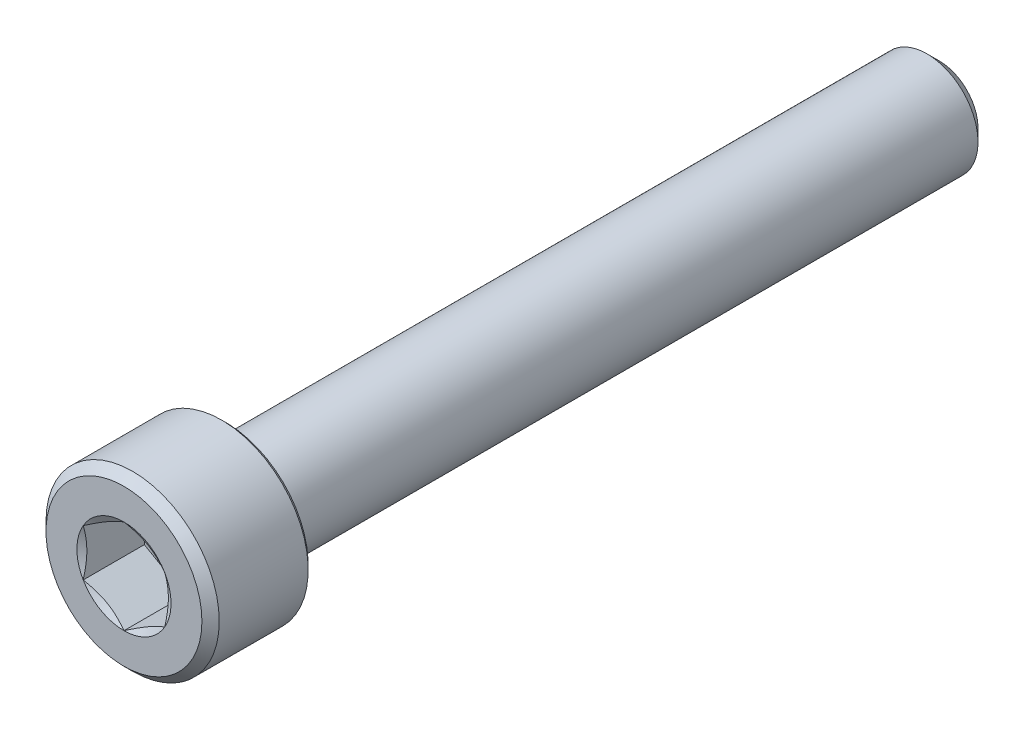
ISO-10303-21;
HEADER;
FILE_DESCRIPTION(('STEP AP214'),'2;1');
FILE_NAME('part.step','',(''),(''),'','','');
FILE_SCHEMA(('AUTOMOTIVE_DESIGN { 1 0 10303 214 1 1 1 1 }'));
ENDSEC;
DATA;
#1=APPLICATION_CONTEXT('core data for automotive mechanical design processes');
#2=APPLICATION_PROTOCOL_DEFINITION('international standard','automotive_design',2000,#1);
#3=PRODUCT_CONTEXT('',#1,'mechanical');
#4=PRODUCT('Part','Part','',(#3));
#5=PRODUCT_RELATED_PRODUCT_CATEGORY('part','',(#4));
#6=PRODUCT_DEFINITION_FORMATION('','',#4);
#7=PRODUCT_DEFINITION_CONTEXT('part definition',#1,'design');
#8=PRODUCT_DEFINITION('design','',#6,#7);
#9=PRODUCT_DEFINITION_SHAPE('','',#8);
#10=(LENGTH_UNIT() NAMED_UNIT(*) SI_UNIT(.MILLI.,.METRE.));
#11=(NAMED_UNIT(*) PLANE_ANGLE_UNIT() SI_UNIT($,.RADIAN.));
#12=(NAMED_UNIT(*) SI_UNIT($,.STERADIAN.) SOLID_ANGLE_UNIT());
#13=UNCERTAINTY_MEASURE_WITH_UNIT(LENGTH_MEASURE(1.E-05),#10,'distance_accuracy_value','');
#14=(GEOMETRIC_REPRESENTATION_CONTEXT(3) GLOBAL_UNCERTAINTY_ASSIGNED_CONTEXT((#13)) GLOBAL_UNIT_ASSIGNED_CONTEXT((#10,
#11,#12)) REPRESENTATION_CONTEXT('',''));
#15=CARTESIAN_POINT('',(0.,0.,0.));
#16=DIRECTION('',(0.,0.,1.));
#17=DIRECTION('',(1.,0.,0.));
#18=AXIS2_PLACEMENT_3D('',#15,#16,#17);
#19=CARTESIAN_POINT('',(0.,4.24999999999999,20.));
#20=DIRECTION('',(0.,0.,1.));
#21=DIRECTION('',(1.,0.,0.));
#22=AXIS2_PLACEMENT_3D('',#19,#20,#21);
#23=PLANE('',#22);
#24=CARTESIAN_POINT('',(0.,0.,20.));
#25=DIRECTION('',(0.,0.,1.));
#26=DIRECTION('',(1.,0.,0.));
#27=AXIS2_PLACEMENT_3D('',#24,#25,#26);
#28=CIRCLE('',#27,3.82499999999999);
#29=CARTESIAN_POINT('',(3.82499999999999,0.,20.));
#30=VERTEX_POINT('',#29);
#31=EDGE_CURVE('E186',#30,#30,#28,.T.);
#32=ORIENTED_EDGE('',*,*,#31,.T.);
#33=EDGE_LOOP('',(#32));
#34=FACE_BOUND('',#33,.T.);
#35=CARTESIAN_POINT('',(0.,0.,20.));
#36=DIRECTION('',(0.,0.,1.));
#37=DIRECTION('',(1.,0.,0.));
#38=AXIS2_PLACEMENT_3D('',#35,#36,#37);
#39=CIRCLE('',#38,2.3094010767585);
#40=CARTESIAN_POINT('',(2.,1.15470053837924,20.));
#41=VERTEX_POINT('',#40);
#42=CARTESIAN_POINT('',(0.,2.3094010767585,20.));
#43=VERTEX_POINT('',#42);
#44=EDGE_CURVE('E96',#41,#43,#39,.T.);
#45=ORIENTED_EDGE('',*,*,#44,.F.);
#46=CARTESIAN_POINT('',(2.,-1.15470053837926,20.));
#47=VERTEX_POINT('',#46);
#48=EDGE_CURVE('E56',#47,#41,#39,.T.);
#49=ORIENTED_EDGE('',*,*,#48,.F.);
#50=CARTESIAN_POINT('',(0.,-2.3094010767585,20.));
#51=VERTEX_POINT('',#50);
#52=EDGE_CURVE('E307',#51,#47,#39,.T.);
#53=ORIENTED_EDGE('',*,*,#52,.F.);
#54=CARTESIAN_POINT('',(-2.,-1.15470053837925,20.));
#55=VERTEX_POINT('',#54);
#56=EDGE_CURVE('E63',#55,#51,#39,.T.);
#57=ORIENTED_EDGE('',*,*,#56,.F.);
#58=CARTESIAN_POINT('',(-2.,1.15470053837925,20.));
#59=VERTEX_POINT('',#58);
#60=EDGE_CURVE('E140',#59,#55,#39,.T.);
#61=ORIENTED_EDGE('',*,*,#60,.F.);
#62=EDGE_CURVE('E106',#43,#59,#39,.T.);
#63=ORIENTED_EDGE('',*,*,#62,.F.);
#64=EDGE_LOOP('',(#45,#49,#53,#57,#61,#63));
#65=FACE_BOUND('',#64,.T.);
#66=ADVANCED_FACE('F41',(#34,#65),#23,.T.);
#67=CARTESIAN_POINT('',(0.,0.,-20.));
#68=DIRECTION('',(0.,0.,-1.));
#69=DIRECTION('',(-1.,0.,0.));
#70=AXIS2_PLACEMENT_3D('',#67,#68,#69);
#71=CYLINDRICAL_SURFACE('',#70,4.25);
#72=CARTESIAN_POINT('',(0.,0.,15.2125));
#73=DIRECTION('',(0.,0.,-1.));
#74=DIRECTION('',(-1.,0.,0.));
#75=AXIS2_PLACEMENT_3D('',#72,#73,#74);
#76=CIRCLE('',#75,4.25);
#77=CARTESIAN_POINT('',(-4.25,0.,15.2125));
#78=VERTEX_POINT('',#77);
#79=EDGE_CURVE('E11',#78,#78,#76,.F.);
#80=ORIENTED_EDGE('',*,*,#79,.T.);
#81=EDGE_LOOP('',(#80));
#82=FACE_BOUND('',#81,.T.);
#83=CARTESIAN_POINT('',(0.,0.,19.575));
#84=DIRECTION('',(0.,0.,1.));
#85=DIRECTION('',(1.,0.,0.));
#86=AXIS2_PLACEMENT_3D('',#83,#84,#85);
#87=CIRCLE('',#86,4.25);
#88=CARTESIAN_POINT('',(4.25,0.,19.575));
#89=VERTEX_POINT('',#88);
#90=EDGE_CURVE('E117',#89,#89,#87,.F.);
#91=ORIENTED_EDGE('',*,*,#90,.T.);
#92=EDGE_LOOP('',(#91));
#93=FACE_BOUND('',#92,.T.);
#94=ADVANCED_FACE('F205',(#82,#93),#71,.T.);
#95=CARTESIAN_POINT('',(0.,4.24999999999999,15.));
#96=DIRECTION('',(0.,0.,-1.));
#97=DIRECTION('',(-1.,0.,0.));
#98=AXIS2_PLACEMENT_3D('',#95,#96,#97);
#99=PLANE('',#98);
#100=CARTESIAN_POINT('',(0.,0.,15.));
#101=DIRECTION('',(0.,0.,-1.));
#102=DIRECTION('',(-1.,0.,0.));
#103=AXIS2_PLACEMENT_3D('',#100,#101,#102);
#104=CIRCLE('',#103,4.03750000000001);
#105=CARTESIAN_POINT('',(-4.03750000000001,0.,15.));
#106=VERTEX_POINT('',#105);
#107=EDGE_CURVE('E50',#106,#106,#104,.T.);
#108=ORIENTED_EDGE('',*,*,#107,.T.);
#109=EDGE_LOOP('',(#108));
#110=FACE_BOUND('',#109,.T.);
#111=CARTESIAN_POINT('',(0.,0.,15.));
#112=DIRECTION('',(0.,0.,-1.));
#113=DIRECTION('',(-1.,0.,0.));
#114=AXIS2_PLACEMENT_3D('',#111,#112,#113);
#115=CIRCLE('',#114,2.5);
#116=CARTESIAN_POINT('',(-2.5,0.,15.));
#117=VERTEX_POINT('',#116);
#118=EDGE_CURVE('E118',#117,#117,#115,.T.);
#119=ORIENTED_EDGE('',*,*,#118,.F.);
#120=EDGE_LOOP('',(#119));
#121=FACE_BOUND('',#120,.T.);
#122=ADVANCED_FACE('F193',(#110,#121),#99,.T.);
#123=CARTESIAN_POINT('',(0.,0.,-20.));
#124=DIRECTION('',(0.,0.,-1.));
#125=DIRECTION('',(-1.,0.,0.));
#126=AXIS2_PLACEMENT_3D('',#123,#124,#125);
#127=CYLINDRICAL_SURFACE('',#126,2.5);
#128=ORIENTED_EDGE('',*,*,#118,.T.);
#129=EDGE_LOOP('',(#128));
#130=FACE_BOUND('',#129,.T.);
#131=CARTESIAN_POINT('',(0.,0.,-19.4));
#132=DIRECTION('',(0.,0.,-1.));
#133=DIRECTION('',(-1.,0.,0.));
#134=AXIS2_PLACEMENT_3D('',#131,#132,#133);
#135=CIRCLE('',#134,2.5);
#136=CARTESIAN_POINT('',(-2.5,0.,-19.4));
#137=VERTEX_POINT('',#136);
#138=EDGE_CURVE('E235',#137,#137,#135,.T.);
#139=ORIENTED_EDGE('',*,*,#138,.F.);
#140=EDGE_LOOP('',(#139));
#141=FACE_BOUND('',#140,.T.);
#142=ADVANCED_FACE('F216',(#130,#141),#127,.T.);
#143=CARTESIAN_POINT('',(0.,0.,-20.));
#144=DIRECTION('',(0.,0.,1.));
#145=DIRECTION('',(1.,0.,0.));
#146=AXIS2_PLACEMENT_3D('',#143,#144,#145);
#147=CONICAL_SURFACE('',#146,1.89999999999999,0.785398163397441);
#148=ORIENTED_EDGE('',*,*,#138,.T.);
#149=EDGE_LOOP('',(#148));
#150=FACE_BOUND('',#149,.T.);
#151=CARTESIAN_POINT('',(0.,0.,-20.));
#152=DIRECTION('',(0.,0.,-1.));
#153=DIRECTION('',(-1.,0.,0.));
#154=AXIS2_PLACEMENT_3D('',#151,#152,#153);
#155=CIRCLE('',#154,1.89999999999999);
#156=CARTESIAN_POINT('',(-1.89999999999999,0.,-20.));
#157=VERTEX_POINT('',#156);
#158=EDGE_CURVE('E232',#157,#157,#155,.T.);
#159=ORIENTED_EDGE('',*,*,#158,.F.);
#160=EDGE_LOOP('',(#159));
#161=FACE_BOUND('',#160,.T.);
#162=ADVANCED_FACE('F219',(#150,#161),#147,.T.);
#163=CARTESIAN_POINT('',(0.,1.89999999999999,-20.));
#164=DIRECTION('',(0.,0.,-1.));
#165=DIRECTION('',(-1.,0.,0.));
#166=AXIS2_PLACEMENT_3D('',#163,#164,#165);
#167=PLANE('',#166);
#168=ORIENTED_EDGE('',*,*,#158,.T.);
#169=EDGE_LOOP('',(#168));
#170=FACE_BOUND('',#169,.T.);
#171=ADVANCED_FACE('F222',(#170),#167,.T.);
#172=CARTESIAN_POINT('',(0.,0.,20.));
#173=DIRECTION('',(0.,0.,1.));
#174=DIRECTION('',(1.,0.,0.));
#175=AXIS2_PLACEMENT_3D('',#172,#173,#174);
#176=CONICAL_SURFACE('',#175,2.3094010767585,1.0471975511966);
#177=ORIENTED_EDGE('',*,*,#62,.T.);
#178=CARTESIAN_POINT('',(0.00019999999999952,2.30951654681234,20.0000666716664));
#179=CARTESIAN_POINT('',(-0.0876912629000603,2.25877250251757,19.9707567411466));
#180=CARTESIAN_POINT('',(-0.176341194473592,2.20759044065995,19.9441000570264));
#181=CARTESIAN_POINT('',(-0.355176246997802,2.10433997494456,19.8975696960666));
#182=CARTESIAN_POINT('',(-0.445364546505036,2.0522697359463,19.8777124814287));
#183=CARTESIAN_POINT('',(-0.624623385763305,1.94877459684592,19.8468006690692));
#184=CARTESIAN_POINT('',(-0.713666338226303,1.89736562427197,19.8355403566444));
#185=CARTESIAN_POINT('',(-0.892171397785042,1.79430568008402,19.8220958676406));
#186=CARTESIAN_POINT('',(-0.981632855703957,1.74265508327244,19.8199005599994));
#187=CARTESIAN_POINT('',(-1.1488083535488,1.64613626458981,19.8244581943766));
#188=CARTESIAN_POINT('',(-1.22654737026578,1.60125362236172,19.8300920797329));
#189=CARTESIAN_POINT('',(-1.38151891453613,1.5117807595605,19.8479511003067));
#190=CARTESIAN_POINT('',(-1.4587509057412,1.46719084864821,19.8601823410694));
#191=CARTESIAN_POINT('',(-1.6140421864822,1.37753338590959,19.8907606419135));
#192=CARTESIAN_POINT('',(-1.69208181310738,1.33247718647008,19.9092373721116));
#193=CARTESIAN_POINT('',(-1.84699686569213,1.24303693915875,19.9511727232588));
#194=CARTESIAN_POINT('',(-1.92387427762312,1.19865174468579,19.9746214855382));
#195=CARTESIAN_POINT('',(-2.0002,1.15458506832541,20.0000666716664));
#196=B_SPLINE_CURVE_WITH_KNOTS('',3,(#178,#179,#180,#181,#182,#183,#184,#185,#186,#187,#188,
#189,#190,#191,#192,#193,#194,#195),.UNSPECIFIED.,.F.,.F.,(4,2,2,2,2,2,2,2,4),(0.,
0.31703182469561,0.634825876346563,0.944753967652634,1.25430138000371,1.52387047293094,
1.79368946861028,2.06949491027634,2.34475850821472),.UNSPECIFIED.);
#197=EDGE_CURVE('E111',#43,#59,#196,.T.);
#198=ORIENTED_EDGE('',*,*,#197,.F.);
#199=EDGE_LOOP('',(#177,#198));
#200=FACE_BOUND('',#199,.T.);
#201=ADVANCED_FACE('F112',(#200),#176,.F.);
#202=ORIENTED_EDGE('',*,*,#60,.T.);
#203=CARTESIAN_POINT('',(-2.,-2.99029024286748,20.7436705774789));
#204=CARTESIAN_POINT('',(-2.,-2.90392335491221,20.7022350128154));
#205=CARTESIAN_POINT('',(-2.,-2.81734606544377,20.6612298310159));
#206=CARTESIAN_POINT('',(-2.,-2.64365854493736,20.5803243821909));
#207=CARTESIAN_POINT('',(-2.,-2.55654822138745,20.5404243140125));
#208=CARTESIAN_POINT('',(-2.,-2.38118302896118,20.4617503389694));
#209=CARTESIAN_POINT('',(-2.,-2.29292442261224,20.4229847316336));
#210=CARTESIAN_POINT('',(-2.,-2.11566660170983,20.3471918635543));
#211=CARTESIAN_POINT('',(-2.,-2.02666742594868,20.3101645124244));
#212=CARTESIAN_POINT('',(-2.,-1.84544249851512,20.2373681681925));
#213=CARTESIAN_POINT('',(-2.,-1.75319322532995,20.201657387434));
#214=CARTESIAN_POINT('',(-2.,-1.56757885700114,20.1332048464352));
#215=CARTESIAN_POINT('',(-2.,-1.4742136338563,20.1004634305571));
#216=CARTESIAN_POINT('',(-2.,-1.28643446361951,20.0388859327172));
#217=CARTESIAN_POINT('',(-2.,-1.19202351048257,20.0100408191443));
#218=CARTESIAN_POINT('',(-2.,-1.00184859453873,19.9572423245237));
#219=CARTESIAN_POINT('',(-2.,-0.906084974095547,19.9332877285792));
#220=CARTESIAN_POINT('',(-2.,-0.713403981060257,19.8915474538638));
#221=CARTESIAN_POINT('',(-2.,-0.616489407871839,19.8737491049484));
#222=CARTESIAN_POINT('',(-2.,-0.421576659767194,19.8454859555612));
#223=CARTESIAN_POINT('',(-2.,-0.323578558532566,19.8350206595082));
#224=CARTESIAN_POINT('',(-2.,-0.128212412243738,19.8223976828881));
#225=CARTESIAN_POINT('',(-2.,-0.0308508865278569,19.8201419664817));
#226=CARTESIAN_POINT('',(-2.,0.163710907351541,19.8238660001585));
#227=CARTESIAN_POINT('',(-2.,0.260911165156857,19.8298462601828));
#228=CARTESIAN_POINT('',(-2.,0.500738496705997,19.8542367986828));
#229=CARTESIAN_POINT('',(-2.,0.642900874941924,19.8772179857328));
#230=CARTESIAN_POINT('',(-2.,0.924461055762403,19.9364797724985));
#231=CARTESIAN_POINT('',(-2.,1.06385531203148,19.9727764011974));
#232=CARTESIAN_POINT('',(-2.,1.27233476439731,20.0347799260889));
#233=CARTESIAN_POINT('',(-2.,1.34249760828297,20.0569967132613));
#234=CARTESIAN_POINT('',(-2.,1.48209294499886,20.1034854664852));
#235=CARTESIAN_POINT('',(-2.,1.5515258636265,20.1277561499463));
#236=CARTESIAN_POINT('',(-2.,1.68975413890004,20.1780002153862));
#237=CARTESIAN_POINT('',(-2.,1.75854960883307,20.2039732879257));
#238=CARTESIAN_POINT('',(-2.,1.89559846372949,20.2573411907401));
#239=CARTESIAN_POINT('',(-2.,1.96385175484501,20.2847362612267));
#240=CARTESIAN_POINT('',(-2.,2.1380709928287,20.3564181386155));
#241=CARTESIAN_POINT('',(-2.,2.24368858156614,20.4015507076219));
#242=CARTESIAN_POINT('',(-2.,2.45396999511265,20.4939914959885));
#243=CARTESIAN_POINT('',(-2.,2.55863374776563,20.5412998783351));
#244=CARTESIAN_POINT('',(-2.,2.87151206778261,20.6857217451608));
#245=CARTESIAN_POINT('',(-2.,3.07857874872549,20.7853171433883));
#246=CARTESIAN_POINT('',(-2.,3.49094307145926,20.9886849551519));
#247=CARTESIAN_POINT('',(-2.,3.69623822556833,21.0924623531372));
#248=CARTESIAN_POINT('',(-2.,4.10542196763742,21.3026856010433));
#249=CARTESIAN_POINT('',(-2.,4.30931073022523,21.4091311117793));
#250=CARTESIAN_POINT('',(-2.,4.69691639401988,21.613726514207));
#251=CARTESIAN_POINT('',(-2.,4.88072085209384,21.7117111050986));
#252=CARTESIAN_POINT('',(-2.,5.2477385233816,21.9087967213488));
#253=CARTESIAN_POINT('',(-2.,5.43095171439013,22.0078977880236));
#254=CARTESIAN_POINT('',(-2.,5.79645714315414,22.2066832443465));
#255=CARTESIAN_POINT('',(-2.,5.97875053807595,22.3063655091631));
#256=CARTESIAN_POINT('',(-2.,6.34296877430456,22.5063788260171));
#257=CARTESIAN_POINT('',(-2.,6.52489363439936,22.6067098438291));
#258=CARTESIAN_POINT('',(-2.,6.70668608827319,22.7072787608358));
#259=B_SPLINE_CURVE_WITH_KNOTS('',3,(#203,#204,#205,#206,#207,#208,#209,#210,#211,#212,#213,
#214,#215,#216,#217,#218,#219,#220,#221,#222,#223,#224,#225,#226,#227,#228,#229,#230,#231,#232,
#233,#234,#235,#236,#237,#238,#239,#240,#241,#242,#243,#244,#245,#246,#247,#248,#249,#250,#251,
#252,#253,#254,#255,#256,#257,#258),.UNSPECIFIED.,.F.,.F.,(4,2,2,2,2,2,2,2,2,2,2,2,2,2,2,2,2,2,
2,2,2,2,2,2,2,2,2,4),(0.,0.287380681388115,0.574812740623685,0.863988372930492,1.15314895189073,
1.44986982597591,1.74662506739397,2.04268017375205,2.33866164470186,2.63403028141923,
2.92937895465127,3.2211888892799,3.51301689251079,3.94415417741652,4.37581217290737,
4.59657665342086,4.81720427698906,5.03779190819846,5.2584169243092,5.60295100374335,
5.94751093378604,6.63674459882492,7.32682556520814,8.01681924533216,8.64168728907531,
9.26657853306546,9.889880351341,10.5131495508289),.UNSPECIFIED.);
#260=EDGE_CURVE('E105',#59,#55,#259,.F.);
#261=ORIENTED_EDGE('',*,*,#260,.F.);
#262=EDGE_LOOP('',(#202,#261));
#263=FACE_BOUND('',#262,.T.);
#264=ADVANCED_FACE('F229',(#263),#176,.F.);
#265=ORIENTED_EDGE('',*,*,#56,.T.);
#266=CARTESIAN_POINT('',(-2.0002,-1.15458506832542,20.0000666716664));
#267=CARTESIAN_POINT('',(-1.91230873709994,-1.20532911262019,19.9707567411466));
#268=CARTESIAN_POINT('',(-1.82365880552641,-1.25651117447781,19.9441000570264));
#269=CARTESIAN_POINT('',(-1.6448237530022,-1.3597616401932,19.8975696960666));
#270=CARTESIAN_POINT('',(-1.55463545349496,-1.41183187919146,19.8777124814287));
#271=CARTESIAN_POINT('',(-1.37537661423669,-1.51532701829184,19.8468006690692));
#272=CARTESIAN_POINT('',(-1.2863336617737,-1.56673599086579,19.8355403566444));
#273=CARTESIAN_POINT('',(-1.10782860221496,-1.66979593505374,19.8220958676406));
#274=CARTESIAN_POINT('',(-1.01836714429604,-1.72144653186532,19.8199005599994));
#275=CARTESIAN_POINT('',(-0.851191646451203,-1.81796535054795,19.8244581943766));
#276=CARTESIAN_POINT('',(-0.773452629734217,-1.86284799277603,19.8300920797329));
#277=CARTESIAN_POINT('',(-0.618481085463867,-1.95232085557725,19.8479511003067));
#278=CARTESIAN_POINT('',(-0.541249094258802,-1.99691076648955,19.8601823410694));
#279=CARTESIAN_POINT('',(-0.385957813517799,-2.08656822922817,19.8907606419135));
#280=CARTESIAN_POINT('',(-0.307918186892621,-2.13162442866767,19.9092373721116));
#281=CARTESIAN_POINT('',(-0.153003134307865,-2.22106467597901,19.9511727232588));
#282=CARTESIAN_POINT('',(-0.0761257223768795,-2.26544987045196,19.9746214855382));
#283=CARTESIAN_POINT('',(0.000200000000000404,-2.30951654681235,20.0000666716664));
#284=B_SPLINE_CURVE_WITH_KNOTS('',3,(#266,#267,#268,#269,#270,#271,#272,#273,#274,#275,#276,
#277,#278,#279,#280,#281,#282,#283),.UNSPECIFIED.,.F.,.F.,(4,2,2,2,2,2,2,2,4),(0.,
0.317031824695609,0.634825876346562,0.944753967652634,1.25430138000371,1.52387047293094,
1.79368946861028,2.06949491027634,2.34475850821472),.UNSPECIFIED.);
#285=EDGE_CURVE('E153',#55,#51,#284,.T.);
#286=ORIENTED_EDGE('',*,*,#285,.F.);
#287=EDGE_LOOP('',(#265,#286));
#288=FACE_BOUND('',#287,.T.);
#289=ADVANCED_FACE('F315',(#288),#176,.F.);
#290=ORIENTED_EDGE('',*,*,#52,.T.);
#291=CARTESIAN_POINT('',(-0.000200000000000021,-2.30951654681235,20.0000666716664));
#292=CARTESIAN_POINT('',(0.0876912629000599,-2.25877250251758,19.9707567411466));
#293=CARTESIAN_POINT('',(0.176341194473591,-2.20759044065996,19.9441000570264));
#294=CARTESIAN_POINT('',(0.355176246997801,-2.10433997494457,19.8975696960666));
#295=CARTESIAN_POINT('',(0.445364546505036,-2.05226973594631,19.8777124814287));
#296=CARTESIAN_POINT('',(0.624623385763306,-1.94877459684593,19.8468006690692));
#297=CARTESIAN_POINT('',(0.713666338226304,-1.89736562427198,19.8355403566444));
#298=CARTESIAN_POINT('',(0.892171397785043,-1.79430568008403,19.8220958676406));
#299=CARTESIAN_POINT('',(0.981632855703958,-1.74265508327245,19.8199005599994));
#300=CARTESIAN_POINT('',(1.1488083535488,-1.64613626458982,19.8244581943766));
#301=CARTESIAN_POINT('',(1.22654737026578,-1.60125362236173,19.8300920797329));
#302=CARTESIAN_POINT('',(1.38151891453613,-1.51178075956051,19.8479511003067));
#303=CARTESIAN_POINT('',(1.4587509057412,-1.46719084864822,19.8601823410694));
#304=CARTESIAN_POINT('',(1.6140421864822,-1.3775333859096,19.8907606419135));
#305=CARTESIAN_POINT('',(1.69208181310738,-1.33247718647009,19.9092373721116));
#306=CARTESIAN_POINT('',(1.84699686569213,-1.24303693915876,19.9511727232588));
#307=CARTESIAN_POINT('',(1.92387427762312,-1.1986517446858,19.9746214855382));
#308=CARTESIAN_POINT('',(2.0002,-1.15458506832542,20.0000666716664));
#309=B_SPLINE_CURVE_WITH_KNOTS('',3,(#291,#292,#293,#294,#295,#296,#297,#298,#299,#300,#301,
#302,#303,#304,#305,#306,#307,#308),.UNSPECIFIED.,.F.,.F.,(4,2,2,2,2,2,2,2,4),(0.,
0.317031824695609,0.634825876346563,0.944753967652636,1.25430138000371,1.52387047293094,
1.79368946861028,2.06949491027634,2.34475850821472),.UNSPECIFIED.);
#310=EDGE_CURVE('E284',#51,#47,#309,.T.);
#311=ORIENTED_EDGE('',*,*,#310,.F.);
#312=EDGE_LOOP('',(#290,#311));
#313=FACE_BOUND('',#312,.T.);
#314=ADVANCED_FACE('F312',(#313),#176,.F.);
#315=ORIENTED_EDGE('',*,*,#48,.T.);
#316=CARTESIAN_POINT('',(2.,-2.99029024286747,20.7436705774789));
#317=CARTESIAN_POINT('',(2.,-2.90392335491221,20.7022350128154));
#318=CARTESIAN_POINT('',(2.,-2.81734606544377,20.6612298310159));
#319=CARTESIAN_POINT('',(2.,-2.64365854493736,20.5803243821909));
#320=CARTESIAN_POINT('',(2.,-2.55654822138745,20.5404243140125));
#321=CARTESIAN_POINT('',(2.,-2.38118302896118,20.4617503389694));
#322=CARTESIAN_POINT('',(2.,-2.29292442261224,20.4229847316336));
#323=CARTESIAN_POINT('',(2.,-2.11566660170983,20.3471918635543));
#324=CARTESIAN_POINT('',(2.,-2.02666742594868,20.3101645124244));
#325=CARTESIAN_POINT('',(2.,-1.84544249851512,20.2373681681925));
#326=CARTESIAN_POINT('',(2.,-1.75319322532995,20.201657387434));
#327=CARTESIAN_POINT('',(2.,-1.56757885700113,20.1332048464352));
#328=CARTESIAN_POINT('',(2.,-1.4742136338563,20.1004634305571));
#329=CARTESIAN_POINT('',(2.,-1.28643446361951,20.0388859327172));
#330=CARTESIAN_POINT('',(2.,-1.19202351048257,20.0100408191443));
#331=CARTESIAN_POINT('',(2.,-1.00184859453872,19.9572423245237));
#332=CARTESIAN_POINT('',(2.,-0.906084974095546,19.9332877285792));
#333=CARTESIAN_POINT('',(2.,-0.713403981060256,19.8915474538638));
#334=CARTESIAN_POINT('',(2.,-0.616489407871839,19.8737491049484));
#335=CARTESIAN_POINT('',(2.,-0.421576659767193,19.8454859555612));
#336=CARTESIAN_POINT('',(2.,-0.323578558532565,19.8350206595082));
#337=CARTESIAN_POINT('',(2.,-0.128212412243737,19.8223976828881));
#338=CARTESIAN_POINT('',(2.,-0.0308508865278556,19.8201419664817));
#339=CARTESIAN_POINT('',(2.,0.163710907351542,19.8238660001585));
#340=CARTESIAN_POINT('',(2.,0.260911165156859,19.8298462601828));
#341=CARTESIAN_POINT('',(2.,0.500738496705998,19.8542367986828));
#342=CARTESIAN_POINT('',(2.,0.642900874941926,19.8772179857328));
#343=CARTESIAN_POINT('',(2.,0.924461055762404,19.9364797724985));
#344=CARTESIAN_POINT('',(2.,1.06385531203148,19.9727764011974));
#345=CARTESIAN_POINT('',(2.,1.27233476439731,20.0347799260889));
#346=CARTESIAN_POINT('',(2.,1.34249760828297,20.0569967132613));
#347=CARTESIAN_POINT('',(2.,1.48209294499886,20.1034854664852));
#348=CARTESIAN_POINT('',(2.,1.5515258636265,20.1277561499463));
#349=CARTESIAN_POINT('',(2.,1.68975413890005,20.1780002153862));
#350=CARTESIAN_POINT('',(2.,1.75854960883307,20.2039732879257));
#351=CARTESIAN_POINT('',(2.,1.89559846372949,20.2573411907401));
#352=CARTESIAN_POINT('',(2.,1.96385175484502,20.2847362612267));
#353=CARTESIAN_POINT('',(2.,2.1380709928287,20.3564181386155));
#354=CARTESIAN_POINT('',(2.,2.24368858156614,20.4015507076219));
#355=CARTESIAN_POINT('',(2.,2.45396999511265,20.4939914959885));
#356=CARTESIAN_POINT('',(2.,2.55863374776564,20.5412998783351));
#357=CARTESIAN_POINT('',(2.,2.87151206778262,20.6857217451608));
#358=CARTESIAN_POINT('',(2.,3.0785787487255,20.7853171433883));
#359=CARTESIAN_POINT('',(2.,3.49094307145926,20.9886849551519));
#360=CARTESIAN_POINT('',(2.,3.69623822556834,21.0924623531372));
#361=CARTESIAN_POINT('',(2.,4.10542196763743,21.3026856010433));
#362=CARTESIAN_POINT('',(2.,4.30931073022523,21.4091311117793));
#363=CARTESIAN_POINT('',(2.,4.69691639401988,21.613726514207));
#364=CARTESIAN_POINT('',(2.,4.88072085209384,21.7117111050986));
#365=CARTESIAN_POINT('',(2.,5.2477385233816,21.9087967213488));
#366=CARTESIAN_POINT('',(2.,5.43095171439014,22.0078977880236));
#367=CARTESIAN_POINT('',(2.,5.79645714315414,22.2066832443465));
#368=CARTESIAN_POINT('',(2.,5.97875053807595,22.3063655091631));
#369=CARTESIAN_POINT('',(2.,6.34296877430456,22.5063788260171));
#370=CARTESIAN_POINT('',(2.,6.52489363439936,22.6067098438291));
#371=CARTESIAN_POINT('',(2.,6.70668608827319,22.7072787608358));
#372=B_SPLINE_CURVE_WITH_KNOTS('',3,(#316,#317,#318,#319,#320,#321,#322,#323,#324,#325,#326,
#327,#328,#329,#330,#331,#332,#333,#334,#335,#336,#337,#338,#339,#340,#341,#342,#343,#344,#345,
#346,#347,#348,#349,#350,#351,#352,#353,#354,#355,#356,#357,#358,#359,#360,#361,#362,#363,#364,
#365,#366,#367,#368,#369,#370,#371),.UNSPECIFIED.,.F.,.F.,(4,2,2,2,2,2,2,2,2,2,2,2,2,2,2,2,2,2,
2,2,2,2,2,2,2,2,2,4),(0.,0.287380681388115,0.574812740623685,0.863988372930493,1.15314895189073,
1.44986982597591,1.74662506739397,2.04268017375206,2.33866164470186,2.63403028141923,
2.92937895465127,3.2211888892799,3.51301689251079,3.94415417741652,4.37581217290737,
4.59657665342086,4.81720427698906,5.03779190819846,5.2584169243092,5.60295100374335,
5.94751093378604,6.63674459882492,7.32682556520814,8.01681924533217,8.64168728907531,
9.26657853306546,9.889880351341,10.5131495508289),.UNSPECIFIED.);
#373=EDGE_CURVE('E129',#47,#41,#372,.T.);
#374=ORIENTED_EDGE('',*,*,#373,.F.);
#375=EDGE_LOOP('',(#315,#374));
#376=FACE_BOUND('',#375,.T.);
#377=ADVANCED_FACE('F325',(#376),#176,.F.);
#378=ORIENTED_EDGE('',*,*,#44,.T.);
#379=CARTESIAN_POINT('',(2.0002,1.15458506832541,20.0000666716664));
#380=CARTESIAN_POINT('',(1.91230873709994,1.20532911262017,19.9707567411466));
#381=CARTESIAN_POINT('',(1.82365880552641,1.25651117447779,19.9441000570264));
#382=CARTESIAN_POINT('',(1.6448237530022,1.35976164019319,19.8975696960666));
#383=CARTESIAN_POINT('',(1.55463545349496,1.41183187919144,19.8777124814287));
#384=CARTESIAN_POINT('',(1.37537661423669,1.51532701829183,19.8468006690692));
#385=CARTESIAN_POINT('',(1.2863336617737,1.56673599086578,19.8355403566444));
#386=CARTESIAN_POINT('',(1.10782860221496,1.66979593505372,19.8220958676406));
#387=CARTESIAN_POINT('',(1.01836714429604,1.72144653186531,19.8199005599994));
#388=CARTESIAN_POINT('',(0.851191646451203,1.81796535054793,19.8244581943766));
#389=CARTESIAN_POINT('',(0.773452629734218,1.86284799277602,19.8300920797329));
#390=CARTESIAN_POINT('',(0.618481085463868,1.95232085557724,19.8479511003067));
#391=CARTESIAN_POINT('',(0.541249094258803,1.99691076648954,19.8601823410694));
#392=CARTESIAN_POINT('',(0.3859578135178,2.08656822922816,19.8907606419135));
#393=CARTESIAN_POINT('',(0.307918186892621,2.13162442866766,19.9092373721116));
#394=CARTESIAN_POINT('',(0.153003134307865,2.22106467597899,19.9511727232588));
#395=CARTESIAN_POINT('',(0.0761257223768795,2.26544987045195,19.9746214855382));
#396=CARTESIAN_POINT('',(-0.000200000000000734,2.30951654681234,20.0000666716664));
#397=B_SPLINE_CURVE_WITH_KNOTS('',3,(#379,#380,#381,#382,#383,#384,#385,#386,#387,#388,#389,
#390,#391,#392,#393,#394,#395,#396),.UNSPECIFIED.,.F.,.F.,(4,2,2,2,2,2,2,2,4),(0.,
0.317031824695609,0.634825876346562,0.944753967652634,1.25430138000371,1.52387047293094,
1.79368946861028,2.06949491027634,2.34475850821472),.UNSPECIFIED.);
#398=EDGE_CURVE('E100',#41,#43,#397,.T.);
#399=ORIENTED_EDGE('',*,*,#398,.F.);
#400=EDGE_LOOP('',(#378,#399));
#401=FACE_BOUND('',#400,.T.);
#402=ADVANCED_FACE('F98',(#401),#176,.F.);
#403=CARTESIAN_POINT('',(0.,0.,17.));
#404=DIRECTION('',(0.,0.,1.));
#405=DIRECTION('',(1.,0.,0.));
#406=AXIS2_PLACEMENT_3D('',#403,#404,#405);
#407=PLANE('',#406);
#408=DIRECTION('',(-0.866025403784439,0.5,0.));
#409=VECTOR('',#408,1.);
#410=CARTESIAN_POINT('',(2.,1.15470053837925,17.));
#411=LINE('',#410,#409);
#412=CARTESIAN_POINT('',(2.,1.15470053837925,17.));
#413=VERTEX_POINT('',#412);
#414=CARTESIAN_POINT('',(0.,2.3094010767585,17.));
#415=VERTEX_POINT('',#414);
#416=EDGE_CURVE('E128',#413,#415,#411,.T.);
#417=ORIENTED_EDGE('',*,*,#416,.T.);
#418=DIRECTION('',(-0.866025403784439,-0.5,0.));
#419=VECTOR('',#418,1.);
#420=CARTESIAN_POINT('',(0.,2.3094010767585,17.));
#421=LINE('',#420,#419);
#422=CARTESIAN_POINT('',(-2.,1.15470053837925,17.));
#423=VERTEX_POINT('',#422);
#424=EDGE_CURVE('E133',#415,#423,#421,.T.);
#425=ORIENTED_EDGE('',*,*,#424,.T.);
#426=DIRECTION('',(0.,-1.,0.));
#427=VECTOR('',#426,1.);
#428=CARTESIAN_POINT('',(-2.,1.15470053837925,17.));
#429=LINE('',#428,#427);
#430=CARTESIAN_POINT('',(-2.,-1.15470053837926,17.));
#431=VERTEX_POINT('',#430);
#432=EDGE_CURVE('E266',#423,#431,#429,.T.);
#433=ORIENTED_EDGE('',*,*,#432,.T.);
#434=DIRECTION('',(0.866025403784439,-0.5,0.));
#435=VECTOR('',#434,1.);
#436=CARTESIAN_POINT('',(-2.,-1.15470053837926,17.));
#437=LINE('',#436,#435);
#438=CARTESIAN_POINT('',(0.,-2.30940107675851,17.));
#439=VERTEX_POINT('',#438);
#440=EDGE_CURVE('E262',#431,#439,#437,.T.);
#441=ORIENTED_EDGE('',*,*,#440,.T.);
#442=DIRECTION('',(0.866025403784438,0.5,0.));
#443=VECTOR('',#442,1.);
#444=CARTESIAN_POINT('',(0.,-2.30940107675851,17.));
#445=LINE('',#444,#443);
#446=CARTESIAN_POINT('',(2.,-1.15470053837926,17.));
#447=VERTEX_POINT('',#446);
#448=EDGE_CURVE('E258',#439,#447,#445,.T.);
#449=ORIENTED_EDGE('',*,*,#448,.T.);
#450=DIRECTION('',(0.,1.,0.));
#451=VECTOR('',#450,1.);
#452=CARTESIAN_POINT('',(2.,-1.15470053837926,17.));
#453=LINE('',#452,#451);
#454=EDGE_CURVE('E137',#447,#413,#453,.T.);
#455=ORIENTED_EDGE('',*,*,#454,.T.);
#456=EDGE_LOOP('',(#417,#425,#433,#441,#449,#455));
#457=FACE_BOUND('',#456,.T.);
#458=ADVANCED_FACE('F173',(#457),#407,.T.);
#459=CARTESIAN_POINT('',(0.,2.3094010767585,17.));
#460=DIRECTION('',(-0.5,0.866025403784438,0.));
#461=DIRECTION('',(-0.866025403784439,-0.5,0.));
#462=AXIS2_PLACEMENT_3D('',#459,#460,#461);
#463=PLANE('',#462);
#464=DIRECTION('',(0.,0.,1.));
#465=VECTOR('',#464,1.);
#466=CARTESIAN_POINT('',(0.,2.3094010767585,17.));
#467=LINE('',#466,#465);
#468=EDGE_CURVE('E124',#415,#43,#467,.T.);
#469=ORIENTED_EDGE('',*,*,#468,.T.);
#470=ORIENTED_EDGE('',*,*,#197,.T.);
#471=DIRECTION('',(0.,0.,1.));
#472=VECTOR('',#471,1.);
#473=CARTESIAN_POINT('',(-2.,1.15470053837925,17.));
#474=LINE('',#473,#472);
#475=EDGE_CURVE('E136',#423,#59,#474,.T.);
#476=ORIENTED_EDGE('',*,*,#475,.F.);
#477=ORIENTED_EDGE('',*,*,#424,.F.);
#478=EDGE_LOOP('',(#469,#470,#476,#477));
#479=FACE_BOUND('',#478,.T.);
#480=ADVANCED_FACE('F131',(#479),#463,.F.);
#481=CARTESIAN_POINT('',(-2.,1.15470053837925,17.));
#482=DIRECTION('',(-1.,0.,0.));
#483=DIRECTION('',(0.,-1.,0.));
#484=AXIS2_PLACEMENT_3D('',#481,#482,#483);
#485=PLANE('',#484);
#486=ORIENTED_EDGE('',*,*,#475,.T.);
#487=ORIENTED_EDGE('',*,*,#260,.T.);
#488=DIRECTION('',(0.,0.,1.));
#489=VECTOR('',#488,1.);
#490=CARTESIAN_POINT('',(-2.,-1.15470053837926,17.));
#491=LINE('',#490,#489);
#492=EDGE_CURVE('E245',#431,#55,#491,.T.);
#493=ORIENTED_EDGE('',*,*,#492,.F.);
#494=ORIENTED_EDGE('',*,*,#432,.F.);
#495=EDGE_LOOP('',(#486,#487,#493,#494));
#496=FACE_BOUND('',#495,.T.);
#497=ADVANCED_FACE('F162',(#496),#485,.F.);
#498=CARTESIAN_POINT('',(-2.,-1.15470053837926,17.));
#499=DIRECTION('',(-0.5,-0.866025403784439,0.));
#500=DIRECTION('',(0.866025403784439,-0.5,0.));
#501=AXIS2_PLACEMENT_3D('',#498,#499,#500);
#502=PLANE('',#501);
#503=ORIENTED_EDGE('',*,*,#492,.T.);
#504=ORIENTED_EDGE('',*,*,#285,.T.);
#505=DIRECTION('',(0.,0.,1.));
#506=VECTOR('',#505,1.);
#507=CARTESIAN_POINT('',(0.,-2.30940107675851,17.));
#508=LINE('',#507,#506);
#509=EDGE_CURVE('E249',#439,#51,#508,.T.);
#510=ORIENTED_EDGE('',*,*,#509,.F.);
#511=ORIENTED_EDGE('',*,*,#440,.F.);
#512=EDGE_LOOP('',(#503,#504,#510,#511));
#513=FACE_BOUND('',#512,.T.);
#514=ADVANCED_FACE('F166',(#513),#502,.F.);
#515=CARTESIAN_POINT('',(0.,-2.30940107675851,17.));
#516=DIRECTION('',(0.5,-0.866025403784439,0.));
#517=DIRECTION('',(0.866025403784439,0.5,0.));
#518=AXIS2_PLACEMENT_3D('',#515,#516,#517);
#519=PLANE('',#518);
#520=ORIENTED_EDGE('',*,*,#509,.T.);
#521=ORIENTED_EDGE('',*,*,#310,.T.);
#522=DIRECTION('',(0.,0.,1.));
#523=VECTOR('',#522,1.);
#524=CARTESIAN_POINT('',(2.,-1.15470053837926,17.));
#525=LINE('',#524,#523);
#526=EDGE_CURVE('E240',#447,#47,#525,.T.);
#527=ORIENTED_EDGE('',*,*,#526,.F.);
#528=ORIENTED_EDGE('',*,*,#448,.F.);
#529=EDGE_LOOP('',(#520,#521,#527,#528));
#530=FACE_BOUND('',#529,.T.);
#531=ADVANCED_FACE('F292',(#530),#519,.F.);
#532=CARTESIAN_POINT('',(2.,-1.15470053837926,17.));
#533=DIRECTION('',(1.,0.,0.));
#534=DIRECTION('',(0.,0.,-1.));
#535=AXIS2_PLACEMENT_3D('',#532,#533,#534);
#536=PLANE('',#535);
#537=ORIENTED_EDGE('',*,*,#526,.T.);
#538=ORIENTED_EDGE('',*,*,#373,.T.);
#539=DIRECTION('',(0.,0.,1.));
#540=VECTOR('',#539,1.);
#541=CARTESIAN_POINT('',(2.,1.15470053837925,17.));
#542=LINE('',#541,#540);
#543=EDGE_CURVE('E126',#413,#41,#542,.T.);
#544=ORIENTED_EDGE('',*,*,#543,.F.);
#545=ORIENTED_EDGE('',*,*,#454,.F.);
#546=EDGE_LOOP('',(#537,#538,#544,#545));
#547=FACE_BOUND('',#546,.T.);
#548=ADVANCED_FACE('F289',(#547),#536,.F.);
#549=CARTESIAN_POINT('',(2.,1.15470053837925,17.));
#550=DIRECTION('',(0.5,0.866025403784439,0.));
#551=DIRECTION('',(-0.866025403784439,0.5,0.));
#552=AXIS2_PLACEMENT_3D('',#549,#550,#551);
#553=PLANE('',#552);
#554=ORIENTED_EDGE('',*,*,#543,.T.);
#555=ORIENTED_EDGE('',*,*,#398,.T.);
#556=ORIENTED_EDGE('',*,*,#468,.F.);
#557=ORIENTED_EDGE('',*,*,#416,.F.);
#558=EDGE_LOOP('',(#554,#555,#556,#557));
#559=FACE_BOUND('',#558,.T.);
#560=ADVANCED_FACE('F122',(#559),#553,.F.);
#561=CARTESIAN_POINT('',(0.,0.,19.575));
#562=DIRECTION('',(0.,0.,-1.));
#563=DIRECTION('',(-1.,0.,0.));
#564=AXIS2_PLACEMENT_3D('',#561,#562,#563);
#565=CONICAL_SURFACE('',#564,4.25,0.785398163397445);
#566=ORIENTED_EDGE('',*,*,#31,.F.);
#567=EDGE_LOOP('',(#566));
#568=FACE_BOUND('',#567,.T.);
#569=ORIENTED_EDGE('',*,*,#90,.F.);
#570=EDGE_LOOP('',(#569));
#571=FACE_BOUND('',#570,.T.);
#572=ADVANCED_FACE('F197',(#568,#571),#565,.T.);
#573=CARTESIAN_POINT('',(0.,0.,15.));
#574=DIRECTION('',(0.,0.,1.));
#575=DIRECTION('',(1.,0.,0.));
#576=AXIS2_PLACEMENT_3D('',#573,#574,#575);
#577=CONICAL_SURFACE('',#576,4.03750000000001,0.78539816339745);
#578=ORIENTED_EDGE('',*,*,#79,.F.);
#579=EDGE_LOOP('',(#578));
#580=FACE_BOUND('',#579,.T.);
#581=ORIENTED_EDGE('',*,*,#107,.F.);
#582=EDGE_LOOP('',(#581));
#583=FACE_BOUND('',#582,.T.);
#584=ADVANCED_FACE('F43',(#580,#583),#577,.T.);
#585=CLOSED_SHELL('',(#66,#94,#122,#142,#162,#171,#201,#264,#289,#314,#377,#402,#458,#480,#497,
#514,#531,#548,#560,#572,#584));
#586=MANIFOLD_SOLID_BREP('B2',#585);
#587=ADVANCED_BREP_SHAPE_REPRESENTATION('',(#18,#586),#14);
#588=SHAPE_DEFINITION_REPRESENTATION(#9,#587);
ENDSEC;
END-ISO-10303-21;
